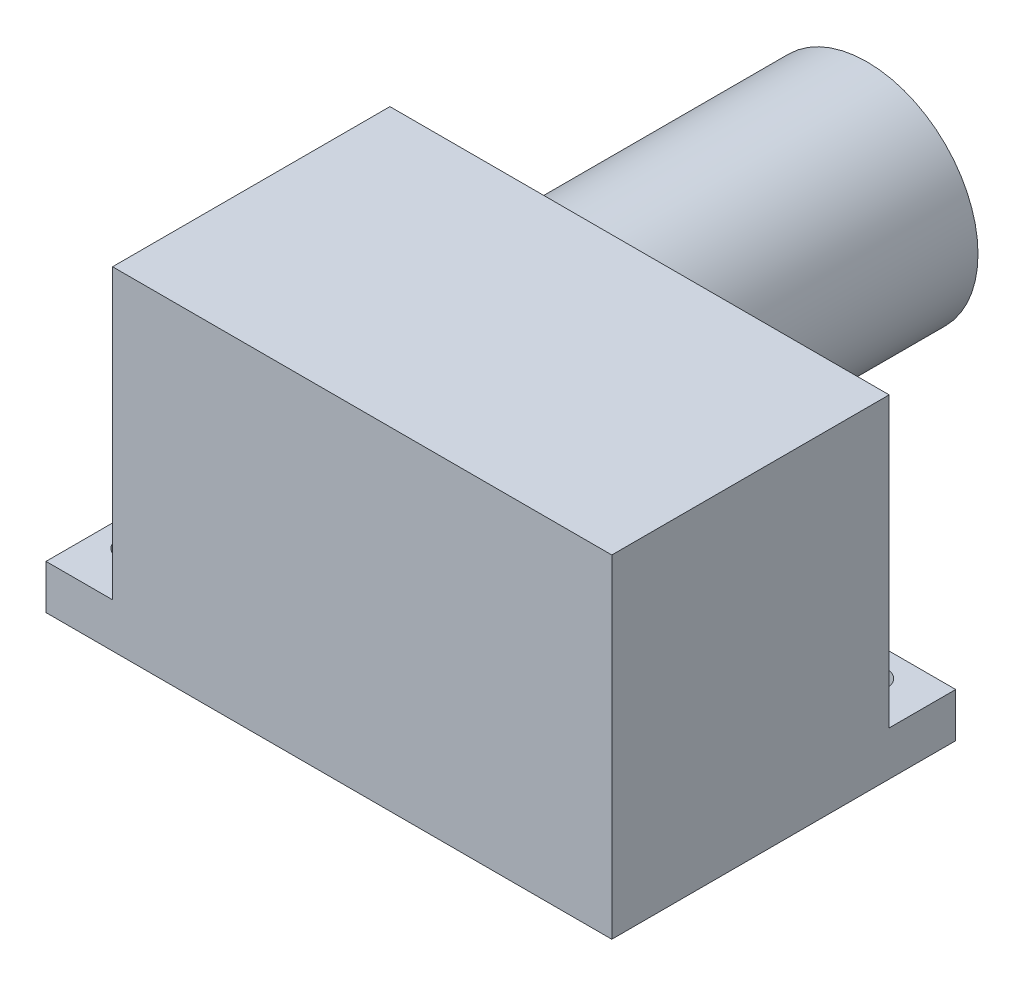
ISO-10303-21;
HEADER;
FILE_DESCRIPTION(('STEP AP214'),'2;1');
FILE_NAME('part.step','',(''),(''),'','','');
FILE_SCHEMA(('AUTOMOTIVE_DESIGN { 1 0 10303 214 1 1 1 1 }'));
ENDSEC;
DATA;
#1=APPLICATION_CONTEXT('core data for automotive mechanical design processes');
#2=APPLICATION_PROTOCOL_DEFINITION('international standard','automotive_design',2000,#1);
#3=PRODUCT_CONTEXT('',#1,'mechanical');
#4=PRODUCT('Part','Part','',(#3));
#5=PRODUCT_RELATED_PRODUCT_CATEGORY('part','',(#4));
#6=PRODUCT_DEFINITION_FORMATION('','',#4);
#7=PRODUCT_DEFINITION_CONTEXT('part definition',#1,'design');
#8=PRODUCT_DEFINITION('design','',#6,#7);
#9=PRODUCT_DEFINITION_SHAPE('','',#8);
#10=(LENGTH_UNIT() NAMED_UNIT(*) SI_UNIT(.MILLI.,.METRE.));
#11=(NAMED_UNIT(*) PLANE_ANGLE_UNIT() SI_UNIT($,.RADIAN.));
#12=(NAMED_UNIT(*) SI_UNIT($,.STERADIAN.) SOLID_ANGLE_UNIT());
#13=UNCERTAINTY_MEASURE_WITH_UNIT(LENGTH_MEASURE(1.E-05),#10,'distance_accuracy_value','');
#14=(GEOMETRIC_REPRESENTATION_CONTEXT(3) GLOBAL_UNCERTAINTY_ASSIGNED_CONTEXT((#13)) GLOBAL_UNIT_ASSIGNED_CONTEXT((#10,
#11,#12)) REPRESENTATION_CONTEXT('',''));
#15=CARTESIAN_POINT('',(0.,0.,0.));
#16=DIRECTION('',(0.,0.,1.));
#17=DIRECTION('',(1.,0.,0.));
#18=AXIS2_PLACEMENT_3D('',#15,#16,#17);
#19=CARTESIAN_POINT('',(0.,0.,0.));
#20=DIRECTION('',(0.,0.,-1.));
#21=DIRECTION('',(-1.,0.,0.));
#22=AXIS2_PLACEMENT_3D('',#19,#20,#21);
#23=PLANE('',#22);
#24=CARTESIAN_POINT('',(-9.49212449538095,0.,0.));
#25=DIRECTION('',(0.,0.,-1.));
#26=DIRECTION('',(-1.,0.,0.));
#27=AXIS2_PLACEMENT_3D('',#24,#25,#26);
#28=CIRCLE('',#27,10.);
#29=CARTESIAN_POINT('',(-19.492124495381,0.,0.));
#30=VERTEX_POINT('',#29);
#31=EDGE_CURVE('E175',#30,#30,#28,.T.);
#32=ORIENTED_EDGE('',*,*,#31,.F.);
#33=EDGE_LOOP('',(#32));
#34=FACE_BOUND('',#33,.T.);
#35=DIRECTION('',(-1.,0.,0.));
#36=VECTOR('',#35,1.);
#37=CARTESIAN_POINT('',(22.5,-11.,0.));
#38=LINE('',#37,#36);
#39=CARTESIAN_POINT('',(22.5,-11.,0.));
#40=VERTEX_POINT('',#39);
#41=CARTESIAN_POINT('',(12.5,-11.,0.));
#42=VERTEX_POINT('',#41);
#43=EDGE_CURVE('E48',#40,#42,#38,.T.);
#44=ORIENTED_EDGE('',*,*,#43,.T.);
#45=DIRECTION('',(0.,1.,0.));
#46=VECTOR('',#45,1.);
#47=CARTESIAN_POINT('',(12.5,-15.,0.));
#48=LINE('',#47,#46);
#49=CARTESIAN_POINT('',(12.5,-15.,0.));
#50=VERTEX_POINT('',#49);
#51=EDGE_CURVE('E53',#50,#42,#48,.T.);
#52=ORIENTED_EDGE('',*,*,#51,.F.);
#53=DIRECTION('',(1.,0.,0.));
#54=VECTOR('',#53,1.);
#55=CARTESIAN_POINT('',(-22.5,-15.,0.));
#56=LINE('',#55,#54);
#57=CARTESIAN_POINT('',(-22.5,-15.,0.));
#58=VERTEX_POINT('',#57);
#59=EDGE_CURVE('E186',#58,#50,#56,.T.);
#60=ORIENTED_EDGE('',*,*,#59,.F.);
#61=DIRECTION('',(0.,-1.,0.));
#62=VECTOR('',#61,1.);
#63=CARTESIAN_POINT('',(-22.5,-15.,0.));
#64=LINE('',#63,#62);
#65=CARTESIAN_POINT('',(-22.5,15.,0.));
#66=VERTEX_POINT('',#65);
#67=EDGE_CURVE('E196',#66,#58,#64,.T.);
#68=ORIENTED_EDGE('',*,*,#67,.F.);
#69=DIRECTION('',(-1.,0.,0.));
#70=VECTOR('',#69,1.);
#71=CARTESIAN_POINT('',(-22.5,15.,0.));
#72=LINE('',#71,#70);
#73=CARTESIAN_POINT('',(22.5,15.,0.));
#74=VERTEX_POINT('',#73);
#75=EDGE_CURVE('E194',#74,#66,#72,.T.);
#76=ORIENTED_EDGE('',*,*,#75,.F.);
#77=DIRECTION('',(0.,1.,0.));
#78=VECTOR('',#77,1.);
#79=CARTESIAN_POINT('',(22.5,-15.,0.));
#80=LINE('',#79,#78);
#81=EDGE_CURVE('E179',#40,#74,#80,.T.);
#82=ORIENTED_EDGE('',*,*,#81,.F.);
#83=EDGE_LOOP('',(#44,#52,#60,#68,#76,#82));
#84=FACE_BOUND('',#83,.T.);
#85=ADVANCED_FACE('F33',(#34,#84),#23,.T.);
#86=CARTESIAN_POINT('',(22.5,-15.,25.));
#87=DIRECTION('',(-1.,0.,0.));
#88=DIRECTION('',(0.,0.,1.));
#89=AXIS2_PLACEMENT_3D('',#86,#87,#88);
#90=PLANE('',#89);
#91=DIRECTION('',(0.,0.,-1.));
#92=VECTOR('',#91,1.);
#93=CARTESIAN_POINT('',(22.5,-15.,25.));
#94=LINE('',#93,#92);
#95=CARTESIAN_POINT('',(22.5,-15.,25.));
#96=VERTEX_POINT('',#95);
#97=CARTESIAN_POINT('',(22.5,-15.,-6.));
#98=VERTEX_POINT('',#97);
#99=EDGE_CURVE('E129',#96,#98,#94,.T.);
#100=ORIENTED_EDGE('',*,*,#99,.T.);
#101=DIRECTION('',(0.,1.,0.));
#102=VECTOR('',#101,1.);
#103=CARTESIAN_POINT('',(22.5,-15.,-6.));
#104=LINE('',#103,#102);
#105=CARTESIAN_POINT('',(22.5,-11.,-6.));
#106=VERTEX_POINT('',#105);
#107=EDGE_CURVE('E122',#98,#106,#104,.T.);
#108=ORIENTED_EDGE('',*,*,#107,.T.);
#109=DIRECTION('',(0.,0.,1.));
#110=VECTOR('',#109,1.);
#111=CARTESIAN_POINT('',(22.5,-11.,-6.));
#112=LINE('',#111,#110);
#113=EDGE_CURVE('E110',#106,#40,#112,.T.);
#114=ORIENTED_EDGE('',*,*,#113,.T.);
#115=ORIENTED_EDGE('',*,*,#81,.T.);
#116=DIRECTION('',(0.,0.,-1.));
#117=VECTOR('',#116,1.);
#118=CARTESIAN_POINT('',(22.5,15.,25.));
#119=LINE('',#118,#117);
#120=CARTESIAN_POINT('',(22.5,15.,25.));
#121=VERTEX_POINT('',#120);
#122=EDGE_CURVE('E11',#121,#74,#119,.T.);
#123=ORIENTED_EDGE('',*,*,#122,.F.);
#124=DIRECTION('',(0.,1.,0.));
#125=VECTOR('',#124,1.);
#126=CARTESIAN_POINT('',(22.5,-15.,25.));
#127=LINE('',#126,#125);
#128=EDGE_CURVE('E182',#96,#121,#127,.T.);
#129=ORIENTED_EDGE('',*,*,#128,.F.);
#130=EDGE_LOOP('',(#100,#108,#114,#115,#123,#129));
#131=FACE_BOUND('',#130,.T.);
#132=ADVANCED_FACE('F35',(#131),#90,.F.);
#133=CARTESIAN_POINT('',(-22.5,15.,25.));
#134=DIRECTION('',(0.,-1.,0.));
#135=DIRECTION('',(0.,0.,-1.));
#136=AXIS2_PLACEMENT_3D('',#133,#134,#135);
#137=PLANE('',#136);
#138=ORIENTED_EDGE('',*,*,#75,.T.);
#139=DIRECTION('',(0.,0.,-1.));
#140=VECTOR('',#139,1.);
#141=CARTESIAN_POINT('',(-22.5,15.,25.));
#142=LINE('',#141,#140);
#143=CARTESIAN_POINT('',(-22.5,15.,25.));
#144=VERTEX_POINT('',#143);
#145=EDGE_CURVE('E41',#144,#66,#142,.T.);
#146=ORIENTED_EDGE('',*,*,#145,.F.);
#147=DIRECTION('',(-1.,0.,0.));
#148=VECTOR('',#147,1.);
#149=CARTESIAN_POINT('',(-22.5,15.,25.));
#150=LINE('',#149,#148);
#151=EDGE_CURVE('E185',#121,#144,#150,.T.);
#152=ORIENTED_EDGE('',*,*,#151,.F.);
#153=ORIENTED_EDGE('',*,*,#122,.T.);
#154=EDGE_LOOP('',(#138,#146,#152,#153));
#155=FACE_BOUND('',#154,.T.);
#156=ADVANCED_FACE('F234',(#155),#137,.F.);
#157=CARTESIAN_POINT('',(-22.5,-15.,25.));
#158=DIRECTION('',(1.,0.,0.));
#159=DIRECTION('',(0.,0.,-1.));
#160=AXIS2_PLACEMENT_3D('',#157,#158,#159);
#161=PLANE('',#160);
#162=DIRECTION('',(0.,0.,-1.));
#163=VECTOR('',#162,1.);
#164=CARTESIAN_POINT('',(-22.5,-15.,25.));
#165=LINE('',#164,#163);
#166=CARTESIAN_POINT('',(-22.5,-15.,15.));
#167=VERTEX_POINT('',#166);
#168=EDGE_CURVE('E201',#167,#58,#165,.T.);
#169=ORIENTED_EDGE('',*,*,#168,.F.);
#170=DIRECTION('',(0.,1.,0.));
#171=VECTOR('',#170,1.);
#172=CARTESIAN_POINT('',(-22.5,-15.,15.));
#173=LINE('',#172,#171);
#174=CARTESIAN_POINT('',(-22.5,-11.,15.));
#175=VERTEX_POINT('',#174);
#176=EDGE_CURVE('E155',#167,#175,#173,.T.);
#177=ORIENTED_EDGE('',*,*,#176,.T.);
#178=DIRECTION('',(0.,0.,-1.));
#179=VECTOR('',#178,1.);
#180=CARTESIAN_POINT('',(-22.5,-11.,25.));
#181=LINE('',#180,#179);
#182=CARTESIAN_POINT('',(-22.5,-11.,25.));
#183=VERTEX_POINT('',#182);
#184=EDGE_CURVE('E150',#183,#175,#181,.T.);
#185=ORIENTED_EDGE('',*,*,#184,.F.);
#186=DIRECTION('',(0.,-1.,0.));
#187=VECTOR('',#186,1.);
#188=CARTESIAN_POINT('',(-22.5,-15.,25.));
#189=LINE('',#188,#187);
#190=EDGE_CURVE('E188',#144,#183,#189,.T.);
#191=ORIENTED_EDGE('',*,*,#190,.F.);
#192=ORIENTED_EDGE('',*,*,#145,.T.);
#193=ORIENTED_EDGE('',*,*,#67,.T.);
#194=EDGE_LOOP('',(#169,#177,#185,#191,#192,#193));
#195=FACE_BOUND('',#194,.T.);
#196=ADVANCED_FACE('F207',(#195),#161,.F.);
#197=CARTESIAN_POINT('',(-22.5,-15.,25.));
#198=DIRECTION('',(0.,1.,0.));
#199=DIRECTION('',(0.,0.,1.));
#200=AXIS2_PLACEMENT_3D('',#197,#198,#199);
#201=PLANE('',#200);
#202=CARTESIAN_POINT('',(17.7894139628023,-15.,-3.));
#203=DIRECTION('',(0.,1.,0.));
#204=DIRECTION('',(0.,0.,1.));
#205=AXIS2_PLACEMENT_3D('',#202,#203,#204);
#206=CIRCLE('',#205,1.5);
#207=CARTESIAN_POINT('',(17.7894139628023,-15.,-1.5));
#208=VERTEX_POINT('',#207);
#209=EDGE_CURVE('E134',#208,#208,#206,.T.);
#210=ORIENTED_EDGE('',*,*,#209,.T.);
#211=EDGE_LOOP('',(#210));
#212=FACE_BOUND('',#211,.T.);
#213=CARTESIAN_POINT('',(-25.5295600315222,-15.,20.));
#214=DIRECTION('',(0.,1.,0.));
#215=DIRECTION('',(0.,0.,1.));
#216=AXIS2_PLACEMENT_3D('',#213,#214,#215);
#217=CIRCLE('',#216,1.5);
#218=CARTESIAN_POINT('',(-25.5295600315222,-15.,21.5));
#219=VERTEX_POINT('',#218);
#220=EDGE_CURVE('E147',#219,#219,#217,.T.);
#221=ORIENTED_EDGE('',*,*,#220,.T.);
#222=EDGE_LOOP('',(#221));
#223=FACE_BOUND('',#222,.T.);
#224=ORIENTED_EDGE('',*,*,#59,.T.);
#225=DIRECTION('',(0.,0.,1.));
#226=VECTOR('',#225,1.);
#227=CARTESIAN_POINT('',(12.5,-15.,-6.));
#228=LINE('',#227,#226);
#229=CARTESIAN_POINT('',(12.5,-15.,-6.));
#230=VERTEX_POINT('',#229);
#231=EDGE_CURVE('E140',#230,#50,#228,.T.);
#232=ORIENTED_EDGE('',*,*,#231,.F.);
#233=DIRECTION('',(-1.,0.,0.));
#234=VECTOR('',#233,1.);
#235=CARTESIAN_POINT('',(22.5,-15.,-6.));
#236=LINE('',#235,#234);
#237=EDGE_CURVE('E117',#98,#230,#236,.T.);
#238=ORIENTED_EDGE('',*,*,#237,.F.);
#239=ORIENTED_EDGE('',*,*,#99,.F.);
#240=DIRECTION('',(1.,0.,0.));
#241=VECTOR('',#240,1.);
#242=CARTESIAN_POINT('',(-22.5,-15.,25.));
#243=LINE('',#242,#241);
#244=CARTESIAN_POINT('',(-28.5,-15.,25.));
#245=VERTEX_POINT('',#244);
#246=EDGE_CURVE('E191',#245,#96,#243,.T.);
#247=ORIENTED_EDGE('',*,*,#246,.F.);
#248=DIRECTION('',(0.,0.,-1.));
#249=VECTOR('',#248,1.);
#250=CARTESIAN_POINT('',(-28.5,-15.,25.));
#251=LINE('',#250,#249);
#252=CARTESIAN_POINT('',(-28.5,-15.,15.));
#253=VERTEX_POINT('',#252);
#254=EDGE_CURVE('E160',#245,#253,#251,.T.);
#255=ORIENTED_EDGE('',*,*,#254,.T.);
#256=DIRECTION('',(1.,0.,0.));
#257=VECTOR('',#256,1.);
#258=CARTESIAN_POINT('',(-28.5,-15.,15.));
#259=LINE('',#258,#257);
#260=EDGE_CURVE('E163',#253,#167,#259,.T.);
#261=ORIENTED_EDGE('',*,*,#260,.T.);
#262=ORIENTED_EDGE('',*,*,#168,.T.);
#263=EDGE_LOOP('',(#224,#232,#238,#239,#247,#255,#261,#262));
#264=FACE_BOUND('',#263,.T.);
#265=ADVANCED_FACE('F212',(#212,#223,#264),#201,.F.);
#266=CARTESIAN_POINT('',(0.,0.,25.));
#267=DIRECTION('',(0.,0.,-1.));
#268=DIRECTION('',(-1.,0.,0.));
#269=AXIS2_PLACEMENT_3D('',#266,#267,#268);
#270=PLANE('',#269);
#271=ORIENTED_EDGE('',*,*,#128,.T.);
#272=ORIENTED_EDGE('',*,*,#151,.T.);
#273=ORIENTED_EDGE('',*,*,#190,.T.);
#274=DIRECTION('',(1.,0.,0.));
#275=VECTOR('',#274,1.);
#276=CARTESIAN_POINT('',(-28.5,-11.,25.));
#277=LINE('',#276,#275);
#278=CARTESIAN_POINT('',(-28.5,-11.,25.));
#279=VERTEX_POINT('',#278);
#280=EDGE_CURVE('E172',#279,#183,#277,.T.);
#281=ORIENTED_EDGE('',*,*,#280,.F.);
#282=DIRECTION('',(0.,1.,0.));
#283=VECTOR('',#282,1.);
#284=CARTESIAN_POINT('',(-28.5,-15.,25.));
#285=LINE('',#284,#283);
#286=EDGE_CURVE('E151',#245,#279,#285,.T.);
#287=ORIENTED_EDGE('',*,*,#286,.F.);
#288=ORIENTED_EDGE('',*,*,#246,.T.);
#289=EDGE_LOOP('',(#271,#272,#273,#281,#287,#288));
#290=FACE_BOUND('',#289,.T.);
#291=ADVANCED_FACE('F238',(#290),#270,.F.);
#292=CARTESIAN_POINT('',(-9.49212449538095,0.,-30.));
#293=DIRECTION('',(0.,0.,1.));
#294=DIRECTION('',(1.,0.,0.));
#295=AXIS2_PLACEMENT_3D('',#292,#293,#294);
#296=CYLINDRICAL_SURFACE('',#295,10.);
#297=CARTESIAN_POINT('',(-9.49212449538095,0.,-30.));
#298=DIRECTION('',(0.,0.,-1.));
#299=DIRECTION('',(-1.,0.,0.));
#300=AXIS2_PLACEMENT_3D('',#297,#298,#299);
#301=CIRCLE('',#300,10.);
#302=CARTESIAN_POINT('',(-19.492124495381,0.,-30.));
#303=VERTEX_POINT('',#302);
#304=EDGE_CURVE('E176',#303,#303,#301,.T.);
#305=ORIENTED_EDGE('',*,*,#304,.F.);
#306=EDGE_LOOP('',(#305));
#307=FACE_BOUND('',#306,.T.);
#308=ORIENTED_EDGE('',*,*,#31,.T.);
#309=EDGE_LOOP('',(#308));
#310=FACE_BOUND('',#309,.T.);
#311=ADVANCED_FACE('F269',(#307,#310),#296,.T.);
#312=CARTESIAN_POINT('',(-9.49212449538095,0.,-30.));
#313=DIRECTION('',(0.,0.,-1.));
#314=DIRECTION('',(-1.,0.,0.));
#315=AXIS2_PLACEMENT_3D('',#312,#313,#314);
#316=PLANE('',#315);
#317=ORIENTED_EDGE('',*,*,#304,.T.);
#318=EDGE_LOOP('',(#317));
#319=FACE_BOUND('',#318,.T.);
#320=ADVANCED_FACE('F261',(#319),#316,.T.);
#321=CARTESIAN_POINT('',(-28.5,-11.,25.));
#322=DIRECTION('',(0.,-1.,0.));
#323=DIRECTION('',(0.,0.,-1.));
#324=AXIS2_PLACEMENT_3D('',#321,#322,#323);
#325=PLANE('',#324);
#326=CARTESIAN_POINT('',(-25.5295600315222,-11.,20.));
#327=DIRECTION('',(0.,1.,0.));
#328=DIRECTION('',(0.,0.,1.));
#329=AXIS2_PLACEMENT_3D('',#326,#327,#328);
#330=CIRCLE('',#329,1.5);
#331=CARTESIAN_POINT('',(-25.5295600315222,-11.,21.5));
#332=VERTEX_POINT('',#331);
#333=EDGE_CURVE('E143',#332,#332,#330,.T.);
#334=ORIENTED_EDGE('',*,*,#333,.F.);
#335=EDGE_LOOP('',(#334));
#336=FACE_BOUND('',#335,.T.);
#337=ORIENTED_EDGE('',*,*,#184,.T.);
#338=DIRECTION('',(1.,0.,0.));
#339=VECTOR('',#338,1.);
#340=CARTESIAN_POINT('',(-28.5,-11.,15.));
#341=LINE('',#340,#339);
#342=CARTESIAN_POINT('',(-28.5,-11.,15.));
#343=VERTEX_POINT('',#342);
#344=EDGE_CURVE('E169',#343,#175,#341,.T.);
#345=ORIENTED_EDGE('',*,*,#344,.F.);
#346=DIRECTION('',(0.,0.,-1.));
#347=VECTOR('',#346,1.);
#348=CARTESIAN_POINT('',(-28.5,-11.,25.));
#349=LINE('',#348,#347);
#350=EDGE_CURVE('E154',#279,#343,#349,.T.);
#351=ORIENTED_EDGE('',*,*,#350,.F.);
#352=ORIENTED_EDGE('',*,*,#280,.T.);
#353=EDGE_LOOP('',(#337,#345,#351,#352));
#354=FACE_BOUND('',#353,.T.);
#355=ADVANCED_FACE('F259',(#336,#354),#325,.F.);
#356=CARTESIAN_POINT('',(-28.5,-15.,15.));
#357=DIRECTION('',(0.,0.,-1.));
#358=DIRECTION('',(0.,1.,0.));
#359=AXIS2_PLACEMENT_3D('',#356,#357,#358);
#360=PLANE('',#359);
#361=ORIENTED_EDGE('',*,*,#176,.F.);
#362=ORIENTED_EDGE('',*,*,#260,.F.);
#363=DIRECTION('',(0.,1.,0.));
#364=VECTOR('',#363,1.);
#365=CARTESIAN_POINT('',(-28.5,-15.,15.));
#366=LINE('',#365,#364);
#367=EDGE_CURVE('E157',#253,#343,#366,.T.);
#368=ORIENTED_EDGE('',*,*,#367,.T.);
#369=ORIENTED_EDGE('',*,*,#344,.T.);
#370=EDGE_LOOP('',(#361,#362,#368,#369));
#371=FACE_BOUND('',#370,.T.);
#372=ADVANCED_FACE('F257',(#371),#360,.T.);
#373=CARTESIAN_POINT('',(-28.5,0.,0.));
#374=DIRECTION('',(-1.,0.,0.));
#375=DIRECTION('',(0.,0.,1.));
#376=AXIS2_PLACEMENT_3D('',#373,#374,#375);
#377=PLANE('',#376);
#378=ORIENTED_EDGE('',*,*,#286,.T.);
#379=ORIENTED_EDGE('',*,*,#350,.T.);
#380=ORIENTED_EDGE('',*,*,#367,.F.);
#381=ORIENTED_EDGE('',*,*,#254,.F.);
#382=EDGE_LOOP('',(#378,#379,#380,#381));
#383=FACE_BOUND('',#382,.T.);
#384=ADVANCED_FACE('F224',(#383),#377,.T.);
#385=CARTESIAN_POINT('',(-25.5295600315222,-17.,20.));
#386=DIRECTION('',(0.,1.,0.));
#387=DIRECTION('',(0.,0.,1.));
#388=AXIS2_PLACEMENT_3D('',#385,#386,#387);
#389=CYLINDRICAL_SURFACE('',#388,1.5);
#390=ORIENTED_EDGE('',*,*,#333,.T.);
#391=EDGE_LOOP('',(#390));
#392=FACE_BOUND('',#391,.T.);
#393=ORIENTED_EDGE('',*,*,#220,.F.);
#394=EDGE_LOOP('',(#393));
#395=FACE_BOUND('',#394,.T.);
#396=ADVANCED_FACE('F216',(#392,#395),#389,.F.);
#397=CARTESIAN_POINT('',(12.5,-15.,-6.));
#398=DIRECTION('',(1.,0.,0.));
#399=DIRECTION('',(0.,0.,-1.));
#400=AXIS2_PLACEMENT_3D('',#397,#398,#399);
#401=PLANE('',#400);
#402=ORIENTED_EDGE('',*,*,#51,.T.);
#403=DIRECTION('',(0.,0.,1.));
#404=VECTOR('',#403,1.);
#405=CARTESIAN_POINT('',(12.5,-11.,-6.));
#406=LINE('',#405,#404);
#407=CARTESIAN_POINT('',(12.5,-11.,-6.));
#408=VERTEX_POINT('',#407);
#409=EDGE_CURVE('E116',#408,#42,#406,.T.);
#410=ORIENTED_EDGE('',*,*,#409,.F.);
#411=DIRECTION('',(0.,1.,0.));
#412=VECTOR('',#411,1.);
#413=CARTESIAN_POINT('',(12.5,-15.,-6.));
#414=LINE('',#413,#412);
#415=EDGE_CURVE('E124',#230,#408,#414,.T.);
#416=ORIENTED_EDGE('',*,*,#415,.F.);
#417=ORIENTED_EDGE('',*,*,#231,.T.);
#418=EDGE_LOOP('',(#402,#410,#416,#417));
#419=FACE_BOUND('',#418,.T.);
#420=ADVANCED_FACE('F214',(#419),#401,.F.);
#421=CARTESIAN_POINT('',(22.5,-11.,-6.));
#422=DIRECTION('',(0.,1.,0.));
#423=DIRECTION('',(0.,0.,1.));
#424=AXIS2_PLACEMENT_3D('',#421,#422,#423);
#425=PLANE('',#424);
#426=CARTESIAN_POINT('',(17.7894139628023,-11.,-3.));
#427=DIRECTION('',(0.,1.,0.));
#428=DIRECTION('',(0.,0.,1.));
#429=AXIS2_PLACEMENT_3D('',#426,#427,#428);
#430=CIRCLE('',#429,1.5);
#431=CARTESIAN_POINT('',(17.7894139628023,-11.,-1.5));
#432=VERTEX_POINT('',#431);
#433=EDGE_CURVE('E359',#432,#432,#430,.T.);
#434=ORIENTED_EDGE('',*,*,#433,.F.);
#435=EDGE_LOOP('',(#434));
#436=FACE_BOUND('',#435,.T.);
#437=ORIENTED_EDGE('',*,*,#43,.F.);
#438=ORIENTED_EDGE('',*,*,#113,.F.);
#439=DIRECTION('',(-1.,0.,0.));
#440=VECTOR('',#439,1.);
#441=CARTESIAN_POINT('',(22.5,-11.,-6.));
#442=LINE('',#441,#440);
#443=EDGE_CURVE('E113',#106,#408,#442,.T.);
#444=ORIENTED_EDGE('',*,*,#443,.T.);
#445=ORIENTED_EDGE('',*,*,#409,.T.);
#446=EDGE_LOOP('',(#437,#438,#444,#445));
#447=FACE_BOUND('',#446,.T.);
#448=ADVANCED_FACE('F112',(#436,#447),#425,.T.);
#449=CARTESIAN_POINT('',(0.,0.,-6.));
#450=DIRECTION('',(0.,0.,1.));
#451=DIRECTION('',(1.,0.,0.));
#452=AXIS2_PLACEMENT_3D('',#449,#450,#451);
#453=PLANE('',#452);
#454=ORIENTED_EDGE('',*,*,#107,.F.);
#455=ORIENTED_EDGE('',*,*,#237,.T.);
#456=ORIENTED_EDGE('',*,*,#415,.T.);
#457=ORIENTED_EDGE('',*,*,#443,.F.);
#458=EDGE_LOOP('',(#454,#455,#456,#457));
#459=FACE_BOUND('',#458,.T.);
#460=ADVANCED_FACE('F121',(#459),#453,.F.);
#461=CARTESIAN_POINT('',(17.7894139628023,-17.,-3.));
#462=DIRECTION('',(0.,1.,0.));
#463=DIRECTION('',(0.,0.,1.));
#464=AXIS2_PLACEMENT_3D('',#461,#462,#463);
#465=CYLINDRICAL_SURFACE('',#464,1.5);
#466=ORIENTED_EDGE('',*,*,#433,.T.);
#467=EDGE_LOOP('',(#466));
#468=FACE_BOUND('',#467,.T.);
#469=ORIENTED_EDGE('',*,*,#209,.F.);
#470=EDGE_LOOP('',(#469));
#471=FACE_BOUND('',#470,.T.);
#472=ADVANCED_FACE('F345',(#468,#471),#465,.F.);
#473=CLOSED_SHELL('',(#85,#132,#156,#196,#265,#291,#311,#320,#355,#372,#384,#396,#420,#448,#460,#472));
#474=MANIFOLD_SOLID_BREP('B2',#473);
#475=ADVANCED_BREP_SHAPE_REPRESENTATION('',(#18,#474),#14);
#476=SHAPE_DEFINITION_REPRESENTATION(#9,#475);
ENDSEC;
END-ISO-10303-21;
